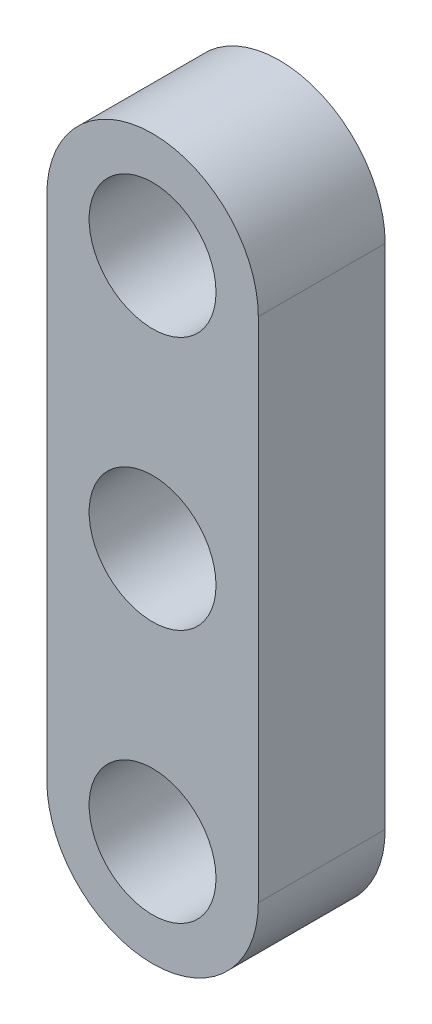
ISO-10303-21;
HEADER;
FILE_DESCRIPTION(('STEP AP214'),'2;1');
FILE_NAME('part.step','',(''),(''),'','','');
FILE_SCHEMA(('AUTOMOTIVE_DESIGN { 1 0 10303 214 1 1 1 1 }'));
ENDSEC;
DATA;
#1=APPLICATION_CONTEXT('core data for automotive mechanical design processes');
#2=APPLICATION_PROTOCOL_DEFINITION('international standard','automotive_design',2000,#1);
#3=PRODUCT_CONTEXT('',#1,'mechanical');
#4=PRODUCT('Part','Part','',(#3));
#5=PRODUCT_RELATED_PRODUCT_CATEGORY('part','',(#4));
#6=PRODUCT_DEFINITION_FORMATION('','',#4);
#7=PRODUCT_DEFINITION_CONTEXT('part definition',#1,'design');
#8=PRODUCT_DEFINITION('design','',#6,#7);
#9=PRODUCT_DEFINITION_SHAPE('','',#8);
#10=(LENGTH_UNIT() NAMED_UNIT(*) SI_UNIT(.MILLI.,.METRE.));
#11=(NAMED_UNIT(*) PLANE_ANGLE_UNIT() SI_UNIT($,.RADIAN.));
#12=(NAMED_UNIT(*) SI_UNIT($,.STERADIAN.) SOLID_ANGLE_UNIT());
#13=UNCERTAINTY_MEASURE_WITH_UNIT(LENGTH_MEASURE(1.E-05),#10,'distance_accuracy_value','');
#14=(GEOMETRIC_REPRESENTATION_CONTEXT(3) GLOBAL_UNCERTAINTY_ASSIGNED_CONTEXT((#13)) GLOBAL_UNIT_ASSIGNED_CONTEXT((#10,
#11,#12)) REPRESENTATION_CONTEXT('',''));
#15=CARTESIAN_POINT('',(0.,0.,0.));
#16=DIRECTION('',(0.,0.,1.));
#17=DIRECTION('',(1.,0.,0.));
#18=AXIS2_PLACEMENT_3D('',#15,#16,#17);
#19=CARTESIAN_POINT('',(27.5,4.00000000000001,-0.517980969521616));
#20=DIRECTION('',(0.,0.,-1.));
#21=DIRECTION('',(-1.,0.,0.));
#22=AXIS2_PLACEMENT_3D('',#19,#20,#21);
#23=PLANE('',#22);
#24=CARTESIAN_POINT('',(27.5,4.00000000000001,-0.517980969521616));
#25=DIRECTION('',(0.,0.,1.));
#26=DIRECTION('',(-1.,0.,0.));
#27=AXIS2_PLACEMENT_3D('',#24,#25,#26);
#28=CIRCLE('',#27,2.5);
#29=CARTESIAN_POINT('',(25.,4.,-0.517980969521616));
#30=VERTEX_POINT('',#29);
#31=CARTESIAN_POINT('',(30.,4.,-0.517980969521616));
#32=VERTEX_POINT('',#31);
#33=EDGE_CURVE('E94',#30,#32,#28,.T.);
#34=ORIENTED_EDGE('',*,*,#33,.T.);
#35=DIRECTION('',(0.,1.,0.));
#36=VECTOR('',#35,1.);
#37=CARTESIAN_POINT('',(30.,4.,-0.517980969521616));
#38=LINE('',#37,#36);
#39=CARTESIAN_POINT('',(30.,16.,-0.517980969521616));
#40=VERTEX_POINT('',#39);
#41=EDGE_CURVE('E89',#32,#40,#38,.T.);
#42=ORIENTED_EDGE('',*,*,#41,.T.);
#43=CARTESIAN_POINT('',(27.5,16.,-0.517980969521616));
#44=DIRECTION('',(0.,0.,1.));
#45=DIRECTION('',(1.,0.,0.));
#46=AXIS2_PLACEMENT_3D('',#43,#44,#45);
#47=CIRCLE('',#46,2.5);
#48=CARTESIAN_POINT('',(25.,16.,-0.517980969521616));
#49=VERTEX_POINT('',#48);
#50=EDGE_CURVE('E92',#40,#49,#47,.T.);
#51=ORIENTED_EDGE('',*,*,#50,.T.);
#52=DIRECTION('',(0.,-1.,0.));
#53=VECTOR('',#52,1.);
#54=CARTESIAN_POINT('',(25.,4.,-0.517980969521616));
#55=LINE('',#54,#53);
#56=EDGE_CURVE('E59',#49,#30,#55,.T.);
#57=ORIENTED_EDGE('',*,*,#56,.T.);
#58=EDGE_LOOP('',(#34,#42,#51,#57));
#59=FACE_BOUND('',#58,.T.);
#60=CARTESIAN_POINT('',(27.5,16.,-0.517980969521616));
#61=DIRECTION('',(0.,0.,1.));
#62=DIRECTION('',(1.,0.,0.));
#63=AXIS2_PLACEMENT_3D('',#60,#61,#62);
#64=CIRCLE('',#63,1.5);
#65=CARTESIAN_POINT('',(29.,16.,-0.517980969521616));
#66=VERTEX_POINT('',#65);
#67=EDGE_CURVE('E114',#66,#66,#64,.T.);
#68=ORIENTED_EDGE('',*,*,#67,.F.);
#69=EDGE_LOOP('',(#68));
#70=FACE_BOUND('',#69,.T.);
#71=CARTESIAN_POINT('',(27.5,4.00000000000001,-0.517980969521616));
#72=DIRECTION('',(0.,0.,1.));
#73=DIRECTION('',(1.,0.,0.));
#74=AXIS2_PLACEMENT_3D('',#71,#72,#73);
#75=CIRCLE('',#74,1.5);
#76=CARTESIAN_POINT('',(29.,4.00000000000001,-0.517980969521616));
#77=VERTEX_POINT('',#76);
#78=EDGE_CURVE('E136',#77,#77,#75,.T.);
#79=ORIENTED_EDGE('',*,*,#78,.F.);
#80=EDGE_LOOP('',(#79));
#81=FACE_BOUND('',#80,.T.);
#82=CARTESIAN_POINT('',(27.5,10.,-0.517980969521616));
#83=DIRECTION('',(0.,0.,1.));
#84=DIRECTION('',(1.,0.,0.));
#85=AXIS2_PLACEMENT_3D('',#82,#83,#84);
#86=CIRCLE('',#85,1.5);
#87=CARTESIAN_POINT('',(29.,10.,-0.517980969521616));
#88=VERTEX_POINT('',#87);
#89=EDGE_CURVE('E144',#88,#88,#86,.T.);
#90=ORIENTED_EDGE('',*,*,#89,.F.);
#91=EDGE_LOOP('',(#90));
#92=FACE_BOUND('',#91,.T.);
#93=ADVANCED_FACE('F41',(#59,#70,#81,#92),#23,.F.);
#94=CARTESIAN_POINT('',(27.5,4.00000000000001,-3.51798096952162));
#95=DIRECTION('',(0.,0.,-1.));
#96=DIRECTION('',(-1.,0.,0.));
#97=AXIS2_PLACEMENT_3D('',#94,#95,#96);
#98=PLANE('',#97);
#99=CARTESIAN_POINT('',(27.5,4.00000000000001,-3.51798096952162));
#100=DIRECTION('',(0.,0.,1.));
#101=DIRECTION('',(1.,0.,0.));
#102=AXIS2_PLACEMENT_3D('',#99,#100,#101);
#103=CIRCLE('',#102,1.5);
#104=CARTESIAN_POINT('',(29.,4.00000000000001,-3.51798096952162));
#105=VERTEX_POINT('',#104);
#106=EDGE_CURVE('E140',#105,#105,#103,.T.);
#107=ORIENTED_EDGE('',*,*,#106,.T.);
#108=EDGE_LOOP('',(#107));
#109=FACE_BOUND('',#108,.T.);
#110=CARTESIAN_POINT('',(27.5,4.00000000000001,-3.51798096952162));
#111=DIRECTION('',(0.,0.,1.));
#112=DIRECTION('',(-1.,0.,0.));
#113=AXIS2_PLACEMENT_3D('',#110,#111,#112);
#114=CIRCLE('',#113,2.5);
#115=CARTESIAN_POINT('',(25.,4.,-3.51798096952162));
#116=VERTEX_POINT('',#115);
#117=CARTESIAN_POINT('',(30.,4.,-3.51798096952162));
#118=VERTEX_POINT('',#117);
#119=EDGE_CURVE('E110',#116,#118,#114,.T.);
#120=ORIENTED_EDGE('',*,*,#119,.F.);
#121=DIRECTION('',(0.,-1.,0.));
#122=VECTOR('',#121,1.);
#123=CARTESIAN_POINT('',(25.,4.,-3.51798096952162));
#124=LINE('',#123,#122);
#125=CARTESIAN_POINT('',(25.,16.,-3.51798096952162));
#126=VERTEX_POINT('',#125);
#127=EDGE_CURVE('E82',#126,#116,#124,.T.);
#128=ORIENTED_EDGE('',*,*,#127,.F.);
#129=CARTESIAN_POINT('',(27.5,16.,-3.51798096952162));
#130=DIRECTION('',(0.,0.,1.));
#131=DIRECTION('',(1.,0.,0.));
#132=AXIS2_PLACEMENT_3D('',#129,#130,#131);
#133=CIRCLE('',#132,2.5);
#134=CARTESIAN_POINT('',(30.,16.,-3.51798096952162));
#135=VERTEX_POINT('',#134);
#136=EDGE_CURVE('E76',#135,#126,#133,.T.);
#137=ORIENTED_EDGE('',*,*,#136,.F.);
#138=DIRECTION('',(0.,1.,0.));
#139=VECTOR('',#138,1.);
#140=CARTESIAN_POINT('',(30.,4.,-3.51798096952162));
#141=LINE('',#140,#139);
#142=EDGE_CURVE('E99',#118,#135,#141,.T.);
#143=ORIENTED_EDGE('',*,*,#142,.F.);
#144=EDGE_LOOP('',(#120,#128,#137,#143));
#145=FACE_BOUND('',#144,.T.);
#146=CARTESIAN_POINT('',(27.5,16.,-3.51798096952162));
#147=DIRECTION('',(0.,0.,1.));
#148=DIRECTION('',(1.,0.,0.));
#149=AXIS2_PLACEMENT_3D('',#146,#147,#148);
#150=CIRCLE('',#149,1.5);
#151=CARTESIAN_POINT('',(29.,16.,-3.51798096952162));
#152=VERTEX_POINT('',#151);
#153=EDGE_CURVE('E132',#152,#152,#150,.T.);
#154=ORIENTED_EDGE('',*,*,#153,.T.);
#155=EDGE_LOOP('',(#154));
#156=FACE_BOUND('',#155,.T.);
#157=CARTESIAN_POINT('',(27.5,10.,-3.51798096952162));
#158=DIRECTION('',(0.,0.,1.));
#159=DIRECTION('',(1.,0.,0.));
#160=AXIS2_PLACEMENT_3D('',#157,#158,#159);
#161=CIRCLE('',#160,1.5);
#162=CARTESIAN_POINT('',(29.,10.,-3.51798096952162));
#163=VERTEX_POINT('',#162);
#164=EDGE_CURVE('E148',#163,#163,#161,.T.);
#165=ORIENTED_EDGE('',*,*,#164,.T.);
#166=EDGE_LOOP('',(#165));
#167=FACE_BOUND('',#166,.T.);
#168=ADVANCED_FACE('F127',(#109,#145,#156,#167),#98,.T.);
#169=CARTESIAN_POINT('',(27.5,4.00000000000001,-0.517980969521616));
#170=DIRECTION('',(0.,0.,-1.));
#171=DIRECTION('',(-1.,0.,0.));
#172=AXIS2_PLACEMENT_3D('',#169,#170,#171);
#173=CYLINDRICAL_SURFACE('',#172,2.5);
#174=ORIENTED_EDGE('',*,*,#119,.T.);
#175=DIRECTION('',(0.,0.,-1.));
#176=VECTOR('',#175,1.);
#177=CARTESIAN_POINT('',(30.,4.,-0.517980969521616));
#178=LINE('',#177,#176);
#179=EDGE_CURVE('E11',#32,#118,#178,.T.);
#180=ORIENTED_EDGE('',*,*,#179,.F.);
#181=ORIENTED_EDGE('',*,*,#33,.F.);
#182=DIRECTION('',(0.,0.,-1.));
#183=VECTOR('',#182,1.);
#184=CARTESIAN_POINT('',(25.,4.,-0.517980969521616));
#185=LINE('',#184,#183);
#186=EDGE_CURVE('E106',#30,#116,#185,.T.);
#187=ORIENTED_EDGE('',*,*,#186,.T.);
#188=EDGE_LOOP('',(#174,#180,#181,#187));
#189=FACE_BOUND('',#188,.T.);
#190=ADVANCED_FACE('F43',(#189),#173,.T.);
#191=CARTESIAN_POINT('',(30.,4.,-0.517980969521616));
#192=DIRECTION('',(-1.,0.,0.));
#193=DIRECTION('',(0.,0.,1.));
#194=AXIS2_PLACEMENT_3D('',#191,#192,#193);
#195=PLANE('',#194);
#196=ORIENTED_EDGE('',*,*,#142,.T.);
#197=DIRECTION('',(0.,0.,-1.));
#198=VECTOR('',#197,1.);
#199=CARTESIAN_POINT('',(30.,16.,-0.517980969521616));
#200=LINE('',#199,#198);
#201=EDGE_CURVE('E51',#40,#135,#200,.T.);
#202=ORIENTED_EDGE('',*,*,#201,.F.);
#203=ORIENTED_EDGE('',*,*,#41,.F.);
#204=ORIENTED_EDGE('',*,*,#179,.T.);
#205=EDGE_LOOP('',(#196,#202,#203,#204));
#206=FACE_BOUND('',#205,.T.);
#207=ADVANCED_FACE('F98',(#206),#195,.F.);
#208=CARTESIAN_POINT('',(27.5,16.,-0.517980969521616));
#209=DIRECTION('',(0.,0.,-1.));
#210=DIRECTION('',(-1.,0.,0.));
#211=AXIS2_PLACEMENT_3D('',#208,#209,#210);
#212=CYLINDRICAL_SURFACE('',#211,2.5);
#213=ORIENTED_EDGE('',*,*,#136,.T.);
#214=DIRECTION('',(0.,0.,-1.));
#215=VECTOR('',#214,1.);
#216=CARTESIAN_POINT('',(25.,16.,-0.517980969521616));
#217=LINE('',#216,#215);
#218=EDGE_CURVE('E101',#49,#126,#217,.T.);
#219=ORIENTED_EDGE('',*,*,#218,.F.);
#220=ORIENTED_EDGE('',*,*,#50,.F.);
#221=ORIENTED_EDGE('',*,*,#201,.T.);
#222=EDGE_LOOP('',(#213,#219,#220,#221));
#223=FACE_BOUND('',#222,.T.);
#224=ADVANCED_FACE('F102',(#223),#212,.T.);
#225=CARTESIAN_POINT('',(25.,4.,-0.517980969521616));
#226=DIRECTION('',(1.,0.,0.));
#227=DIRECTION('',(0.,0.,-1.));
#228=AXIS2_PLACEMENT_3D('',#225,#226,#227);
#229=PLANE('',#228);
#230=ORIENTED_EDGE('',*,*,#127,.T.);
#231=ORIENTED_EDGE('',*,*,#186,.F.);
#232=ORIENTED_EDGE('',*,*,#56,.F.);
#233=ORIENTED_EDGE('',*,*,#218,.T.);
#234=EDGE_LOOP('',(#230,#231,#232,#233));
#235=FACE_BOUND('',#234,.T.);
#236=ADVANCED_FACE('F124',(#235),#229,.F.);
#237=CARTESIAN_POINT('',(27.5,16.,-0.517980969521616));
#238=DIRECTION('',(0.,0.,-1.));
#239=DIRECTION('',(-1.,0.,0.));
#240=AXIS2_PLACEMENT_3D('',#237,#238,#239);
#241=CYLINDRICAL_SURFACE('',#240,1.5);
#242=ORIENTED_EDGE('',*,*,#67,.T.);
#243=EDGE_LOOP('',(#242));
#244=FACE_BOUND('',#243,.T.);
#245=ORIENTED_EDGE('',*,*,#153,.F.);
#246=EDGE_LOOP('',(#245));
#247=FACE_BOUND('',#246,.T.);
#248=ADVANCED_FACE('F167',(#244,#247),#241,.F.);
#249=CARTESIAN_POINT('',(27.5,4.00000000000001,-0.517980969521616));
#250=DIRECTION('',(0.,0.,-1.));
#251=DIRECTION('',(-1.,0.,0.));
#252=AXIS2_PLACEMENT_3D('',#249,#250,#251);
#253=CYLINDRICAL_SURFACE('',#252,1.5);
#254=ORIENTED_EDGE('',*,*,#78,.T.);
#255=EDGE_LOOP('',(#254));
#256=FACE_BOUND('',#255,.T.);
#257=ORIENTED_EDGE('',*,*,#106,.F.);
#258=EDGE_LOOP('',(#257));
#259=FACE_BOUND('',#258,.T.);
#260=ADVANCED_FACE('F213',(#256,#259),#253,.F.);
#261=CARTESIAN_POINT('',(27.5,10.,-0.517980969521616));
#262=DIRECTION('',(0.,0.,-1.));
#263=DIRECTION('',(-1.,0.,0.));
#264=AXIS2_PLACEMENT_3D('',#261,#262,#263);
#265=CYLINDRICAL_SURFACE('',#264,1.5);
#266=ORIENTED_EDGE('',*,*,#89,.T.);
#267=EDGE_LOOP('',(#266));
#268=FACE_BOUND('',#267,.T.);
#269=ORIENTED_EDGE('',*,*,#164,.F.);
#270=EDGE_LOOP('',(#269));
#271=FACE_BOUND('',#270,.T.);
#272=ADVANCED_FACE('F156',(#268,#271),#265,.F.);
#273=CLOSED_SHELL('',(#93,#168,#190,#207,#224,#236,#248,#260,#272));
#274=MANIFOLD_SOLID_BREP('B2',#273);
#275=ADVANCED_BREP_SHAPE_REPRESENTATION('',(#18,#274),#14);
#276=SHAPE_DEFINITION_REPRESENTATION(#9,#275);
ENDSEC;
END-ISO-10303-21;
